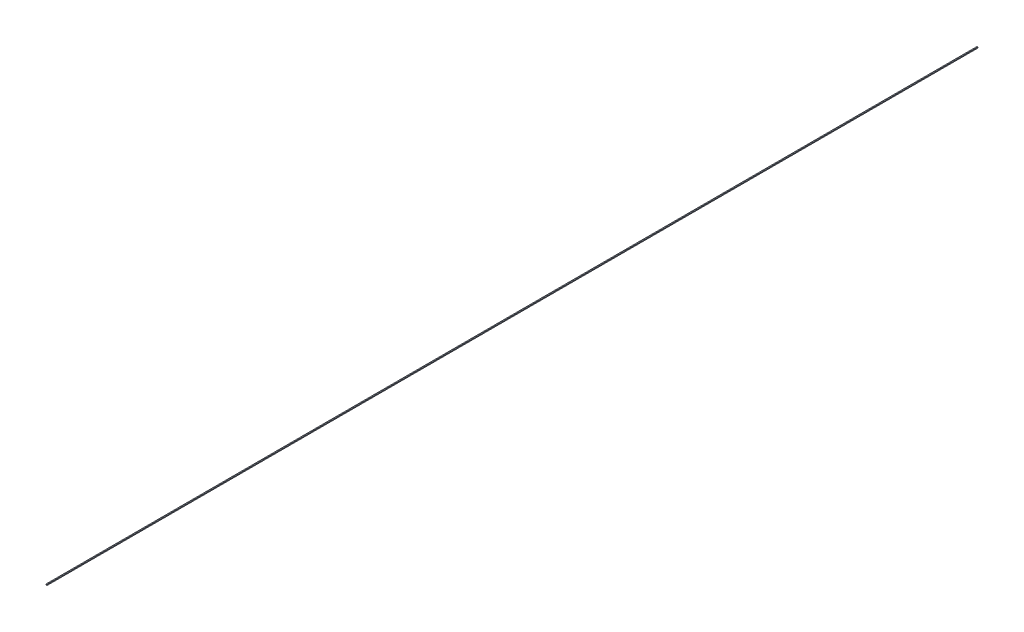
ISO-10303-21;
HEADER;
FILE_DESCRIPTION(('STEP AP214'),'2;1');
FILE_NAME('part.step','',(''),(''),'','','');
FILE_SCHEMA(('AUTOMOTIVE_DESIGN { 1 0 10303 214 1 1 1 1 }'));
ENDSEC;
DATA;
#1=APPLICATION_CONTEXT('core data for automotive mechanical design processes');
#2=APPLICATION_PROTOCOL_DEFINITION('international standard','automotive_design',2000,#1);
#3=PRODUCT_CONTEXT('',#1,'mechanical');
#4=PRODUCT('Part','Part','',(#3));
#5=PRODUCT_RELATED_PRODUCT_CATEGORY('part','',(#4));
#6=PRODUCT_DEFINITION_FORMATION('','',#4);
#7=PRODUCT_DEFINITION_CONTEXT('part definition',#1,'design');
#8=PRODUCT_DEFINITION('design','',#6,#7);
#9=PRODUCT_DEFINITION_SHAPE('','',#8);
#10=(LENGTH_UNIT() NAMED_UNIT(*) SI_UNIT(.MILLI.,.METRE.));
#11=(NAMED_UNIT(*) PLANE_ANGLE_UNIT() SI_UNIT($,.RADIAN.));
#12=(NAMED_UNIT(*) SI_UNIT($,.STERADIAN.) SOLID_ANGLE_UNIT());
#13=UNCERTAINTY_MEASURE_WITH_UNIT(LENGTH_MEASURE(1.E-05),#10,'distance_accuracy_value','');
#14=(GEOMETRIC_REPRESENTATION_CONTEXT(3) GLOBAL_UNCERTAINTY_ASSIGNED_CONTEXT((#13)) GLOBAL_UNIT_ASSIGNED_CONTEXT((#10,
#11,#12)) REPRESENTATION_CONTEXT('',''));
#15=CARTESIAN_POINT('',(0.,0.,0.));
#16=DIRECTION('',(0.,0.,1.));
#17=DIRECTION('',(1.,0.,0.));
#18=AXIS2_PLACEMENT_3D('',#15,#16,#17);
#19=CARTESIAN_POINT('',(0.,0.,2540.));
#20=DIRECTION('',(1.,0.,0.));
#21=DIRECTION('',(0.,0.,-1.));
#22=AXIS2_PLACEMENT_3D('',#19,#20,#21);
#23=PLANE('',#22);
#24=DIRECTION('',(0.,-1.,0.));
#25=VECTOR('',#24,1.);
#26=CARTESIAN_POINT('',(0.,0.,0.));
#27=LINE('',#26,#25);
#28=CARTESIAN_POINT('',(0.,2.54,0.));
#29=VERTEX_POINT('',#28);
#30=CARTESIAN_POINT('',(0.,0.,0.));
#31=VERTEX_POINT('',#30);
#32=EDGE_CURVE('E100',#29,#31,#27,.T.);
#33=ORIENTED_EDGE('',*,*,#32,.T.);
#34=DIRECTION('',(0.,0.,-1.));
#35=VECTOR('',#34,1.);
#36=CARTESIAN_POINT('',(0.,0.,2540.));
#37=LINE('',#36,#35);
#38=CARTESIAN_POINT('',(0.,0.,2540.));
#39=VERTEX_POINT('',#38);
#40=EDGE_CURVE('E11',#39,#31,#37,.T.);
#41=ORIENTED_EDGE('',*,*,#40,.F.);
#42=DIRECTION('',(0.,-1.,0.));
#43=VECTOR('',#42,1.);
#44=CARTESIAN_POINT('',(0.,0.,2540.));
#45=LINE('',#44,#43);
#46=CARTESIAN_POINT('',(0.,2.54,2540.));
#47=VERTEX_POINT('',#46);
#48=EDGE_CURVE('E88',#47,#39,#45,.T.);
#49=ORIENTED_EDGE('',*,*,#48,.F.);
#50=DIRECTION('',(0.,0.,-1.));
#51=VECTOR('',#50,1.);
#52=CARTESIAN_POINT('',(0.,2.54,2540.));
#53=LINE('',#52,#51);
#54=EDGE_CURVE('E96',#47,#29,#53,.T.);
#55=ORIENTED_EDGE('',*,*,#54,.T.);
#56=EDGE_LOOP('',(#33,#41,#49,#55));
#57=FACE_BOUND('',#56,.T.);
#58=ADVANCED_FACE('F37',(#57),#23,.F.);
#59=CARTESIAN_POINT('',(0.,0.,2540.));
#60=DIRECTION('',(0.,1.,0.));
#61=DIRECTION('',(0.,0.,1.));
#62=AXIS2_PLACEMENT_3D('',#59,#60,#61);
#63=PLANE('',#62);
#64=DIRECTION('',(1.,0.,0.));
#65=VECTOR('',#64,1.);
#66=CARTESIAN_POINT('',(0.,0.,0.));
#67=LINE('',#66,#65);
#68=CARTESIAN_POINT('',(2.54,0.,0.));
#69=VERTEX_POINT('',#68);
#70=EDGE_CURVE('E92',#31,#69,#67,.T.);
#71=ORIENTED_EDGE('',*,*,#70,.T.);
#72=DIRECTION('',(0.,0.,-1.));
#73=VECTOR('',#72,1.);
#74=CARTESIAN_POINT('',(2.54,0.,2540.));
#75=LINE('',#74,#73);
#76=CARTESIAN_POINT('',(2.54,0.,2540.));
#77=VERTEX_POINT('',#76);
#78=EDGE_CURVE('E45',#77,#69,#75,.T.);
#79=ORIENTED_EDGE('',*,*,#78,.F.);
#80=DIRECTION('',(1.,0.,0.));
#81=VECTOR('',#80,1.);
#82=CARTESIAN_POINT('',(0.,0.,2540.));
#83=LINE('',#82,#81);
#84=EDGE_CURVE('E83',#39,#77,#83,.T.);
#85=ORIENTED_EDGE('',*,*,#84,.F.);
#86=ORIENTED_EDGE('',*,*,#40,.T.);
#87=EDGE_LOOP('',(#71,#79,#85,#86));
#88=FACE_BOUND('',#87,.T.);
#89=ADVANCED_FACE('F91',(#88),#63,.F.);
#90=CARTESIAN_POINT('',(2.54,0.,2540.));
#91=DIRECTION('',(-1.,0.,0.));
#92=DIRECTION('',(0.,0.,1.));
#93=AXIS2_PLACEMENT_3D('',#90,#91,#92);
#94=PLANE('',#93);
#95=DIRECTION('',(0.,1.,0.));
#96=VECTOR('',#95,1.);
#97=CARTESIAN_POINT('',(2.54,0.,0.));
#98=LINE('',#97,#96);
#99=CARTESIAN_POINT('',(2.54,2.54,0.));
#100=VERTEX_POINT('',#99);
#101=EDGE_CURVE('E70',#69,#100,#98,.T.);
#102=ORIENTED_EDGE('',*,*,#101,.T.);
#103=DIRECTION('',(0.,0.,-1.));
#104=VECTOR('',#103,1.);
#105=CARTESIAN_POINT('',(2.54,2.54,2540.));
#106=LINE('',#105,#104);
#107=CARTESIAN_POINT('',(2.54,2.54,2540.));
#108=VERTEX_POINT('',#107);
#109=EDGE_CURVE('E93',#108,#100,#106,.T.);
#110=ORIENTED_EDGE('',*,*,#109,.F.);
#111=DIRECTION('',(0.,1.,0.));
#112=VECTOR('',#111,1.);
#113=CARTESIAN_POINT('',(2.54,0.,2540.));
#114=LINE('',#113,#112);
#115=EDGE_CURVE('E86',#77,#108,#114,.T.);
#116=ORIENTED_EDGE('',*,*,#115,.F.);
#117=ORIENTED_EDGE('',*,*,#78,.T.);
#118=EDGE_LOOP('',(#102,#110,#116,#117));
#119=FACE_BOUND('',#118,.T.);
#120=ADVANCED_FACE('F94',(#119),#94,.F.);
#121=CARTESIAN_POINT('',(0.,2.54,2540.));
#122=DIRECTION('',(0.,-1.,0.));
#123=DIRECTION('',(0.,0.,-1.));
#124=AXIS2_PLACEMENT_3D('',#121,#122,#123);
#125=PLANE('',#124);
#126=DIRECTION('',(-1.,0.,0.));
#127=VECTOR('',#126,1.);
#128=CARTESIAN_POINT('',(0.,2.54,0.));
#129=LINE('',#128,#127);
#130=EDGE_CURVE('E76',#100,#29,#129,.T.);
#131=ORIENTED_EDGE('',*,*,#130,.T.);
#132=ORIENTED_EDGE('',*,*,#54,.F.);
#133=DIRECTION('',(-1.,0.,0.));
#134=VECTOR('',#133,1.);
#135=CARTESIAN_POINT('',(0.,2.54,2540.));
#136=LINE('',#135,#134);
#137=EDGE_CURVE('E53',#108,#47,#136,.T.);
#138=ORIENTED_EDGE('',*,*,#137,.F.);
#139=ORIENTED_EDGE('',*,*,#109,.T.);
#140=EDGE_LOOP('',(#131,#132,#138,#139));
#141=FACE_BOUND('',#140,.T.);
#142=ADVANCED_FACE('F107',(#141),#125,.F.);
#143=CARTESIAN_POINT('',(0.,2.54,2540.));
#144=DIRECTION('',(0.,0.,-1.));
#145=DIRECTION('',(-1.,0.,0.));
#146=AXIS2_PLACEMENT_3D('',#143,#144,#145);
#147=PLANE('',#146);
#148=ORIENTED_EDGE('',*,*,#48,.T.);
#149=ORIENTED_EDGE('',*,*,#84,.T.);
#150=ORIENTED_EDGE('',*,*,#115,.T.);
#151=ORIENTED_EDGE('',*,*,#137,.T.);
#152=EDGE_LOOP('',(#148,#149,#150,#151));
#153=FACE_BOUND('',#152,.T.);
#154=ADVANCED_FACE('F84',(#153),#147,.F.);
#155=CARTESIAN_POINT('',(0.,2.54,0.));
#156=DIRECTION('',(0.,0.,-1.));
#157=DIRECTION('',(-1.,0.,0.));
#158=AXIS2_PLACEMENT_3D('',#155,#156,#157);
#159=PLANE('',#158);
#160=ORIENTED_EDGE('',*,*,#32,.F.);
#161=ORIENTED_EDGE('',*,*,#130,.F.);
#162=ORIENTED_EDGE('',*,*,#101,.F.);
#163=ORIENTED_EDGE('',*,*,#70,.F.);
#164=EDGE_LOOP('',(#160,#161,#162,#163));
#165=FACE_BOUND('',#164,.T.);
#166=ADVANCED_FACE('F110',(#165),#159,.T.);
#167=CLOSED_SHELL('',(#58,#89,#120,#142,#154,#166));
#168=MANIFOLD_SOLID_BREP('B2',#167);
#169=ADVANCED_BREP_SHAPE_REPRESENTATION('',(#18,#168),#14);
#170=SHAPE_DEFINITION_REPRESENTATION(#9,#169);
ENDSEC;
END-ISO-10303-21;
